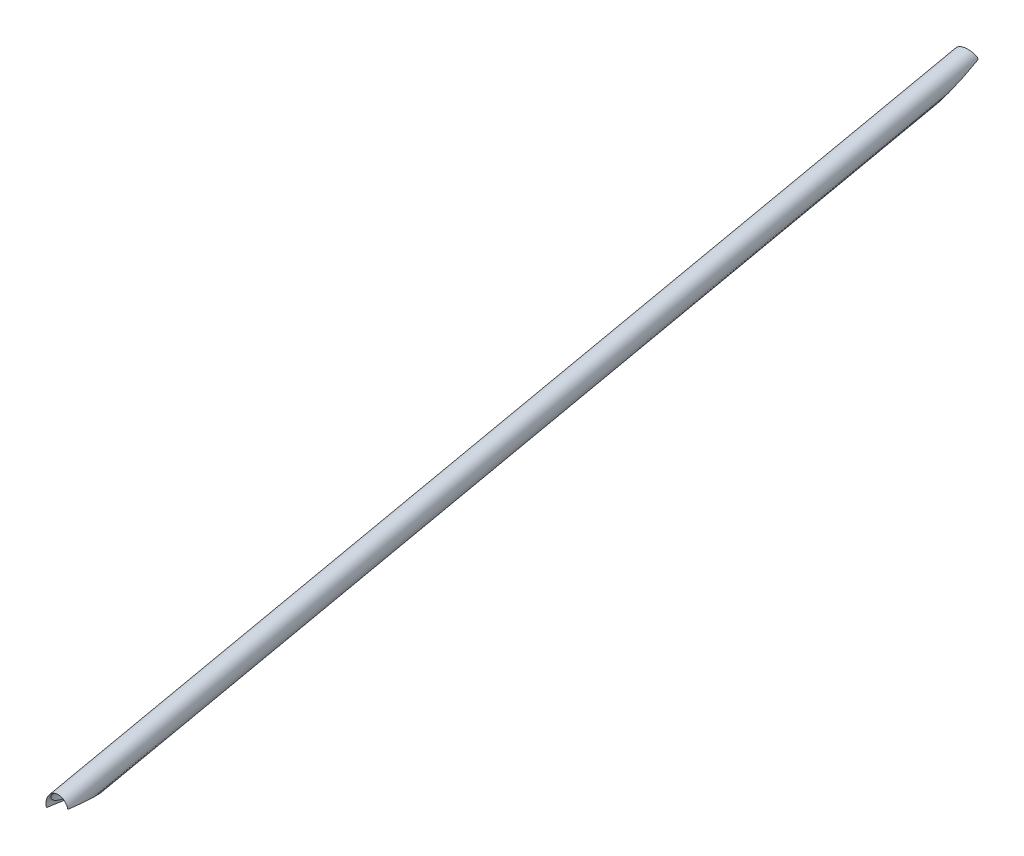
ISO-10303-21;
HEADER;
FILE_DESCRIPTION(('STEP AP214'),'2;1');
FILE_NAME('part.step','',(''),(''),'','','');
FILE_SCHEMA(('AUTOMOTIVE_DESIGN { 1 0 10303 214 1 1 1 1 }'));
ENDSEC;
DATA;
#1=APPLICATION_CONTEXT('core data for automotive mechanical design processes');
#2=APPLICATION_PROTOCOL_DEFINITION('international standard','automotive_design',2000,#1);
#3=PRODUCT_CONTEXT('',#1,'mechanical');
#4=PRODUCT('Part','Part','',(#3));
#5=PRODUCT_RELATED_PRODUCT_CATEGORY('part','',(#4));
#6=PRODUCT_DEFINITION_FORMATION('','',#4);
#7=PRODUCT_DEFINITION_CONTEXT('part definition',#1,'design');
#8=PRODUCT_DEFINITION('design','',#6,#7);
#9=PRODUCT_DEFINITION_SHAPE('','',#8);
#10=(LENGTH_UNIT() NAMED_UNIT(*) SI_UNIT(.MILLI.,.METRE.));
#11=(NAMED_UNIT(*) PLANE_ANGLE_UNIT() SI_UNIT($,.RADIAN.));
#12=(NAMED_UNIT(*) SI_UNIT($,.STERADIAN.) SOLID_ANGLE_UNIT());
#13=UNCERTAINTY_MEASURE_WITH_UNIT(LENGTH_MEASURE(1.E-05),#10,'distance_accuracy_value','');
#14=(GEOMETRIC_REPRESENTATION_CONTEXT(3) GLOBAL_UNCERTAINTY_ASSIGNED_CONTEXT((#13)) GLOBAL_UNIT_ASSIGNED_CONTEXT((#10,
#11,#12)) REPRESENTATION_CONTEXT('',''));
#15=CARTESIAN_POINT('',(0.,0.,0.));
#16=DIRECTION('',(0.,0.,1.));
#17=DIRECTION('',(1.,0.,0.));
#18=AXIS2_PLACEMENT_3D('',#15,#16,#17);
#19=CARTESIAN_POINT('',(-325.,320.,-1580.));
#20=DIRECTION('',(0.042712653678304,-0.062929792122569,-0.997103540500768));
#21=DIRECTION('',(0.,0.998014330188054,-0.0629872744234134));
#22=AXIS2_PLACEMENT_3D('',#19,#20,#21);
#23=PLANE('',#22);
#24=CARTESIAN_POINT('',(-325.,320.,-1580.));
#25=DIRECTION('',(0.042712653678304,-0.062929792122569,-0.997103540500768));
#26=DIRECTION('',(-0.611440895819702,0.787641342485716,-0.0759022168747456));
#27=AXIS2_PLACEMENT_3D('',#24,#25,#26);
#28=ELLIPSE('',#27,12.7897245671064,12.5);
#29=CARTESIAN_POINT('',(-314.143685620965,326.206690751994,-1579.92667136909));
#30=VERTEX_POINT('',#29);
#31=CARTESIAN_POINT('',(-313.287224923611,324.429594636014,-1579.7778262469));
#32=VERTEX_POINT('',#31);
#33=EDGE_CURVE('E114',#30,#32,#28,.T.);
#34=ORIENTED_EDGE('',*,*,#33,.T.);
#35=CARTESIAN_POINT('',(-324.999999999999,320.,-1580.));
#36=DIRECTION('',(0.042712653678304,-0.062929792122569,-0.997103540500768));
#37=DIRECTION('',(0.449608041943724,-0.890035166065743,0.0754321667848475));
#38=AXIS2_PLACEMENT_3D('',#35,#36,#37);
#39=ELLIPSE('',#38,15.3791838355893,12.5);
#40=EDGE_CURVE('E119',#32,#30,#39,.F.);
#41=ORIENTED_EDGE('',*,*,#40,.T.);
#42=EDGE_LOOP('',(#34,#41));
#43=FACE_BOUND('',#42,.T.);
#44=ADVANCED_FACE('F41',(#43),#23,.T.);
#45=CARTESIAN_POINT('',(-225.,200.,-450.));
#46=DIRECTION('',(-0.0876619818920292,0.105194378270435,-0.99058039537993));
#47=DIRECTION('',(0.,0.994408591727349,0.105600912395825));
#48=AXIS2_PLACEMENT_3D('',#45,#46,#47);
#49=CYLINDRICAL_SURFACE('',#48,11.3);
#50=CARTESIAN_POINT('',(-324.527494998541,330.669811084768,-1573.46740317344));
#51=CARTESIAN_POINT('',(-324.22991833195,330.671890688319,-1573.48694557491));
#52=CARTESIAN_POINT('',(-323.932307858229,330.662075607769,-1573.50633371624));
#53=CARTESIAN_POINT('',(-323.338640129705,330.618628362509,-1573.54347430956));
#54=CARTESIAN_POINT('',(-323.042583141786,330.584992232224,-1573.56122648864));
#55=CARTESIAN_POINT('',(-322.453437432487,330.493916145814,-1573.59343522251));
#56=CARTESIAN_POINT('',(-322.160354826378,330.436434552453,-1573.60788594374));
#57=CARTESIAN_POINT('',(-321.579575098919,330.297946482537,-1573.63130440361));
#58=CARTESIAN_POINT('',(-321.291877709912,330.216941178482,-1573.64027241545));
#59=CARTESIAN_POINT('',(-320.722131605198,330.031369165204,-1573.65006371326));
#60=CARTESIAN_POINT('',(-320.440126314284,329.926666056391,-1573.65083855758));
#61=CARTESIAN_POINT('',(-319.885608291381,329.694828115232,-1573.64072036513));
#62=CARTESIAN_POINT('',(-319.61309695512,329.567690001187,-1573.6298256202));
#63=CARTESIAN_POINT('',(-319.080659937344,329.292804597591,-1573.59232749403));
#64=CARTESIAN_POINT('',(-318.820702769833,329.145112906356,-1573.56576588472));
#65=CARTESIAN_POINT('',(-318.315280072179,328.831194619245,-1573.49234692427));
#66=CARTESIAN_POINT('',(-318.06980656504,328.664978374445,-1573.44550086577));
#67=CARTESIAN_POINT('',(-317.666361395377,328.369097827387,-1573.34450291742));
#68=CARTESIAN_POINT('',(-317.50402416305,328.243206821644,-1573.29663470223));
#69=CARTESIAN_POINT('',(-317.188822442626,327.98566765898,-1573.18722487599));
#70=CARTESIAN_POINT('',(-317.035955428439,327.854021053432,-1573.12568693148));
#71=CARTESIAN_POINT('',(-316.740668325697,327.587038164811,-1572.9881020213));
#72=CARTESIAN_POINT('',(-316.598235841143,327.451706530652,-1572.91207267115));
#73=CARTESIAN_POINT('',(-316.324158384668,327.179265680443,-1572.74518152417));
#74=CARTESIAN_POINT('',(-316.192513786003,327.042156403075,-1572.65431921445));
#75=CARTESIAN_POINT('',(-315.940506496505,326.768504881307,-1572.45844698739));
#76=CARTESIAN_POINT('',(-315.820116645126,326.631962073846,-1572.3534727027));
#77=CARTESIAN_POINT('',(-315.590002417244,326.360788903843,-1572.13025676735));
#78=CARTESIAN_POINT('',(-315.480278190465,326.22615856817,-1572.01201493049));
#79=CARTESIAN_POINT('',(-315.270779835019,325.95992960071,-1571.76360425056));
#80=CARTESIAN_POINT('',(-315.171015594934,325.828334079702,-1571.63342379566));
#81=CARTESIAN_POINT('',(-314.980681189384,325.569075396897,-1571.36284969414));
#82=CARTESIAN_POINT('',(-314.890111949128,325.441412631718,-1571.22245502219));
#83=CARTESIAN_POINT('',(-314.722987471503,325.198808644315,-1570.94275892204));
#84=CARTESIAN_POINT('',(-314.645899882952,325.08358810625,-1570.80401427361));
#85=CARTESIAN_POINT('',(-314.498054199409,324.856924491118,-1570.52018068149));
#86=CARTESIAN_POINT('',(-314.427297419092,324.745482201625,-1570.37509042933));
#87=CARTESIAN_POINT('',(-314.291318307502,324.526216542793,-1570.0795122743));
#88=CARTESIAN_POINT('',(-314.226100043918,324.418395867836,-1569.92902051781));
#89=CARTESIAN_POINT('',(-314.100556511849,324.206246967197,-1569.62359561608));
#90=CARTESIAN_POINT('',(-314.040231642548,324.101919026846,-1569.46866210989));
#91=CARTESIAN_POINT('',(-313.923582246642,323.896004336926,-1569.1543132864));
#92=CARTESIAN_POINT('',(-313.867278958263,323.79443367842,-1568.99487960706));
#93=CARTESIAN_POINT('',(-313.758466120743,323.59429591807,-1568.67286959075));
#94=CARTESIAN_POINT('',(-313.705956623255,323.495728857131,-1568.51029321102));
#95=CARTESIAN_POINT('',(-313.604298916831,323.30137323231,-1568.18257889695));
#96=CARTESIAN_POINT('',(-313.555148982218,323.205583256733,-1568.01744233199));
#97=CARTESIAN_POINT('',(-313.459798272915,323.016472440593,-1567.68493457679));
#98=CARTESIAN_POINT('',(-313.413597395101,322.923151513758,-1567.51756346494));
#99=CARTESIAN_POINT('',(-313.264779231262,322.617506999833,-1566.9596724199));
#100=CARTESIAN_POINT('',(-313.167825809873,322.409989574154,-1566.56499982454));
#101=CARTESIAN_POINT('',(-312.984719444651,322.004146345618,-1565.76845607));
#102=CARTESIAN_POINT('',(-312.898569002465,321.805822678438,-1565.366583268));
#103=CARTESIAN_POINT('',(-312.734928418317,321.416223222131,-1564.5573399317));
#104=CARTESIAN_POINT('',(-312.657444615259,321.224952659405,-1564.14996561445));
#105=CARTESIAN_POINT('',(-312.509735726778,320.84802295203,-1563.33131925227));
#106=CARTESIAN_POINT('',(-312.439510979912,320.662364069391,-1562.92004702652));
#107=CARTESIAN_POINT('',(-312.305114582053,320.294955819605,-1562.0934546475));
#108=CARTESIAN_POINT('',(-312.240959420199,320.113218082411,-1561.6781266684));
#109=CARTESIAN_POINT('',(-312.118172646877,319.753192904372,-1560.84516280767));
#110=CARTESIAN_POINT('',(-312.059541132376,319.57490552414,-1560.42752688566));
#111=CARTESIAN_POINT('',(-311.947300043115,319.221099630609,-1559.59063751702));
#112=CARTESIAN_POINT('',(-311.893688241762,319.045579918663,-1559.17138487427));
#113=CARTESIAN_POINT('',(-311.791087386183,318.696621502327,-1558.33144830653));
#114=CARTESIAN_POINT('',(-311.7420983873,318.523182822872,-1557.91076436446));
#115=CARTESIAN_POINT('',(-311.601344654273,318.00408952934,-1556.64425651327));
#116=CARTESIAN_POINT('',(-311.516157050634,317.660809736352,-1555.79672235769));
#117=CARTESIAN_POINT('',(-311.362133077917,316.977506271413,-1554.09877316485));
#118=CARTESIAN_POINT('',(-311.293298458222,316.637482951558,-1553.24835782923));
#119=CARTESIAN_POINT('',(-311.171912603106,315.959117750207,-1551.54729808268));
#120=CARTESIAN_POINT('',(-311.119335180671,315.620774037551,-1550.69665627256));
#121=CARTESIAN_POINT('',(-311.03081133304,314.943539747609,-1548.99476140396));
#122=CARTESIAN_POINT('',(-310.99486413293,314.604649196541,-1548.14350837583));
#123=CARTESIAN_POINT('',(-310.94876701369,314.025449030486,-1546.6930747546));
#124=CARTESIAN_POINT('',(-310.934131171509,313.785639909453,-1546.09383502125));
#125=CARTESIAN_POINT('',(-310.914303218245,313.304569709359,-1544.89578259034));
#126=CARTESIAN_POINT('',(-310.909111022314,313.063308643363,-1544.29696988901));
#127=CARTESIAN_POINT('',(-310.908988420093,312.578683348002,-1543.09967007323));
#128=CARTESIAN_POINT('',(-310.914065665461,312.33531768505,-1542.50118353415));
#129=CARTESIAN_POINT('',(-310.935583968858,311.846170099078,-1541.30540457908));
#130=CARTESIAN_POINT('',(-310.952024857439,311.600388212142,-1540.70811214541));
#131=CARTESIAN_POINT('',(-310.997617365976,311.106826035252,-1539.5175688299));
#132=CARTESIAN_POINT('',(-311.026718989419,310.859057330703,-1538.92431127933));
#133=CARTESIAN_POINT('',(-311.09951959715,310.359960337871,-1537.740199451));
#134=CARTESIAN_POINT('',(-311.143217999068,310.108632191981,-1537.14934507831));
#135=CARTESIAN_POINT('',(-311.247774414229,309.601860721366,-1535.97149207174));
#136=CARTESIAN_POINT('',(-311.30861802488,309.346421019588,-1535.38449062298));
#137=CARTESIAN_POINT('',(-311.451117984676,308.830300969743,-1534.21537921512));
#138=CARTESIAN_POINT('',(-311.532770602884,308.569621568835,-1533.63326839845));
#139=CARTESIAN_POINT('',(-311.699014480892,308.106822090654,-1532.61898781092));
#140=CARTESIAN_POINT('',(-311.777914412688,307.906115607689,-1532.18524556824));
#141=CARTESIAN_POINT('',(-311.954189365726,307.500122051136,-1531.32325464643));
#142=CARTESIAN_POINT('',(-312.051575358518,307.294832321544,-1530.89500939175));
#143=CARTESIAN_POINT('',(-312.215639560175,306.982368741453,-1530.2581118207));
#144=CARTESIAN_POINT('',(-312.273492765592,306.877190301256,-1530.0462006651));
#145=CARTESIAN_POINT('',(-312.396101860453,306.665340311064,-1529.62514989883));
#146=CARTESIAN_POINT('',(-312.460857050994,306.558668913196,-1529.41601000995));
#147=CARTESIAN_POINT('',(-312.598350696457,306.343781843623,-1529.00145086242));
#148=CARTESIAN_POINT('',(-312.671080888738,306.235567869426,-1528.79602800507));
#149=CARTESIAN_POINT('',(-312.826059561427,306.017350546439,-1528.38980559806));
#150=CARTESIAN_POINT('',(-312.908305823863,305.907347619727,-1528.18900498408));
#151=CARTESIAN_POINT('',(-313.085799217333,305.683490251871,-1527.79019457859));
#152=CARTESIAN_POINT('',(-313.18124384421,305.569602123161,-1527.59229049847));
#153=CARTESIAN_POINT('',(-313.38675763426,305.339792198979,-1527.2055542152));
#154=CARTESIAN_POINT('',(-313.496815788568,305.223871990845,-1527.01671532732));
#155=CARTESIAN_POINT('',(-313.734181841562,304.991249189082,-1526.65394275856));
#156=CARTESIAN_POINT('',(-313.861307869171,304.874565751826,-1526.47987984509));
#157=CARTESIAN_POINT('',(-314.13816302195,304.640333407195,-1526.15177347299));
#158=CARTESIAN_POINT('',(-314.287820200516,304.522788348705,-1525.9976690964));
#159=CARTESIAN_POINT('',(-314.563633703149,304.325856472094,-1525.76423516486));
#160=CARTESIAN_POINT('',(-314.682406209025,304.246081227636,-1525.67662272954));
#161=CARTESIAN_POINT('',(-314.934145658899,304.088965879863,-1525.52168072422));
#162=CARTESIAN_POINT('',(-315.067097142795,304.011623240966,-1525.45432936265));
#163=CARTESIAN_POINT('',(-315.325444360263,303.873327164501,-1525.35429015047));
#164=CARTESIAN_POINT('',(-315.449006299023,303.811650473049,-1525.31792909591));
#165=CARTESIAN_POINT('',(-315.703340012969,303.694275322767,-1525.2677158373));
#166=CARTESIAN_POINT('',(-315.834106261101,303.638572375029,-1525.25384661974));
#167=CARTESIAN_POINT('',(-316.099120024441,303.534997494025,-1525.24969480059));
#168=CARTESIAN_POINT('',(-316.233369185012,303.487129343011,-1525.2594235553));
#169=CARTESIAN_POINT('',(-316.501300294147,303.400151922389,-1525.30084409504));
#170=CARTESIAN_POINT('',(-316.634981577888,303.361051068657,-1525.33255686445));
#171=CARTESIAN_POINT('',(-316.948539945882,303.278323328622,-1525.43003928949));
#172=CARTESIAN_POINT('',(-317.126805360522,303.238560056806,-1525.50414618248));
#173=CARTESIAN_POINT('',(-317.473133616928,303.172898083276,-1525.67787821321));
#174=CARTESIAN_POINT('',(-317.641168701038,303.147035730978,-1525.7775692559));
#175=CARTESIAN_POINT('',(-317.950857105551,303.10832183224,-1525.98425298197));
#176=CARTESIAN_POINT('',(-318.093493855679,303.094458766495,-1526.08962322729));
#177=CARTESIAN_POINT('',(-318.370837841532,303.073973941512,-1526.31107579461));
#178=CARTESIAN_POINT('',(-318.505537871943,303.06735866915,-1526.42716761198));
#179=CARTESIAN_POINT('',(-318.768084530392,303.059980188981,-1526.6675449744));
#180=CARTESIAN_POINT('',(-318.895914365603,303.059230725614,-1526.7918490758));
#181=CARTESIAN_POINT('',(-319.145208896575,303.062552477599,-1527.04647384957));
#182=CARTESIAN_POINT('',(-319.266676036233,303.066621827665,-1527.17679217517));
#183=CARTESIAN_POINT('',(-319.576184800323,303.082430586274,-1527.52270697421));
#184=CARTESIAN_POINT('',(-319.75987553825,303.097326613682,-1527.7420451776));
#185=CARTESIAN_POINT('',(-320.115721893663,303.134993534608,-1528.18930275687));
#186=CARTESIAN_POINT('',(-320.287870858537,303.157768923944,-1528.41722696546));
#187=CARTESIAN_POINT('',(-320.622833431221,303.209619752799,-1528.87975948189));
#188=CARTESIAN_POINT('',(-320.785628826174,303.238706989491,-1529.11437958173));
#189=CARTESIAN_POINT('',(-321.103061771176,303.301998587488,-1529.58840721571));
#190=CARTESIAN_POINT('',(-321.257698345262,303.336203559111,-1529.82781531789));
#191=CARTESIAN_POINT('',(-321.560807150141,303.409086936623,-1530.31170647659));
#192=CARTESIAN_POINT('',(-321.709240173083,303.447789237176,-1530.55621039584));
#193=CARTESIAN_POINT('',(-321.99995903265,303.528870314996,-1531.04824607444));
#194=CARTESIAN_POINT('',(-322.142244606716,303.57124924906,-1531.29577796255));
#195=CARTESIAN_POINT('',(-322.421224462761,303.659129795593,-1531.79297768566));
#196=CARTESIAN_POINT('',(-322.557925877133,303.704627212405,-1532.04264227001));
#197=CARTESIAN_POINT('',(-322.826527622677,303.798410578825,-1532.54400604243));
#198=CARTESIAN_POINT('',(-322.958428062036,303.846696465532,-1532.79570518449));
#199=CARTESIAN_POINT('',(-323.368063365633,304.003029349413,-1533.59298671028));
#200=CARTESIAN_POINT('',(-323.637988615176,304.115591340788,-1534.14170651899));
#201=CARTESIAN_POINT('',(-324.161725815199,304.349974515007,-1535.24486455776));
#202=CARTESIAN_POINT('',(-324.415535183783,304.471797174649,-1535.79930368765));
#203=CARTESIAN_POINT('',(-324.909767499399,304.72329697255,-1536.91269556979));
#204=CARTESIAN_POINT('',(-325.150183359196,304.852978194838,-1537.47165053581));
#205=CARTESIAN_POINT('',(-325.61945592071,305.119121973216,-1538.59279337525));
#206=CARTESIAN_POINT('',(-325.848312231429,305.255584758381,-1539.15498135731));
#207=CARTESIAN_POINT('',(-326.296535935575,305.534940334334,-1540.28330159354));
#208=CARTESIAN_POINT('',(-326.515877249094,305.677848846495,-1540.84944028912));
#209=CARTESIAN_POINT('',(-326.945630735865,305.969273789334,-1541.98366101293));
#210=CARTESIAN_POINT('',(-327.156042796755,306.117790290535,-1542.55174306552));
#211=CARTESIAN_POINT('',(-327.568823834631,306.420054994818,-1543.68920686485));
#212=CARTESIAN_POINT('',(-327.771195420438,306.573801470423,-1544.25858812559));
#213=CARTESIAN_POINT('',(-328.168757652446,306.886388379949,-1545.3984647368));
#214=CARTESIAN_POINT('',(-328.363948192664,307.045228888987,-1545.96896010359));
#215=CARTESIAN_POINT('',(-328.747505132579,307.367686877886,-1547.10982530351));
#216=CARTESIAN_POINT('',(-328.935881746271,307.531296482325,-1547.68019393255));
#217=CARTESIAN_POINT('',(-329.30669372903,307.863586478885,-1548.82137645961));
#218=CARTESIAN_POINT('',(-329.489129161128,308.032266817174,-1549.39219035286));
#219=CARTESIAN_POINT('',(-329.848580120098,308.374910885762,-1550.53403720551));
#220=CARTESIAN_POINT('',(-330.025594852231,308.548875383405,-1551.10507018473));
#221=CARTESIAN_POINT('',(-330.374616319108,308.902396090813,-1552.24693351495));
#222=CARTESIAN_POINT('',(-330.546623071495,309.081952280873,-1552.81776386667));
#223=CARTESIAN_POINT('',(-330.885753791939,309.446871660756,-1553.95791220318));
#224=CARTESIAN_POINT('',(-331.052885260164,309.632224910716,-1554.52723113665));
#225=CARTESIAN_POINT('',(-331.38292658772,310.009755901746,-1555.66482798117));
#226=CARTESIAN_POINT('',(-331.545836474633,310.201933598207,-1556.23310589901));
#227=CARTESIAN_POINT('',(-331.867758219808,310.594141326559,-1557.36795173452));
#228=CARTESIAN_POINT('',(-332.026770678886,310.794170135616,-1557.93451990381));
#229=CARTESIAN_POINT('',(-332.34124464091,311.203592914434,-1559.06524233944));
#230=CARTESIAN_POINT('',(-332.496706289047,311.412986500233,-1559.6293967037));
#231=CARTESIAN_POINT('',(-332.722106457177,311.728258138706,-1560.45344686885));
#232=CARTESIAN_POINT('',(-332.793324196612,311.829615174441,-1560.71472502905));
#233=CARTESIAN_POINT('',(-332.935075595726,312.035127579553,-1561.23636364492));
#234=CARTESIAN_POINT('',(-333.005609257891,312.139282938757,-1561.49672410392));
#235=CARTESIAN_POINT('',(-333.216246899267,312.456485392485,-1562.27629829667));
#236=CARTESIAN_POINT('',(-333.355355059321,312.674223705631,-1562.79388590513));
#237=CARTESIAN_POINT('',(-333.63095588945,313.125769182318,-1563.82280400112));
#238=CARTESIAN_POINT('',(-333.767448505934,313.359576674666,-1564.33413436036));
#239=CARTESIAN_POINT('',(-333.969941892546,313.726329367481,-1565.09392242472));
#240=CARTESIAN_POINT('',(-334.037059025952,313.851240938043,-1565.34595975278));
#241=CARTESIAN_POINT('',(-334.170432465511,314.107345998761,-1565.84704537499));
#242=CARTESIAN_POINT('',(-334.236688814819,314.238539172435,-1566.09609381894));
#243=CARTESIAN_POINT('',(-334.38445645274,314.541720732593,-1566.6517281345));
#244=CARTESIAN_POINT('',(-334.465679453934,314.715762275802,-1566.95727899764));
#245=CARTESIAN_POINT('',(-334.625869590245,315.077928434653,-1567.5604948522));
#246=CARTESIAN_POINT('',(-334.70483724936,315.26604974166,-1567.85816167419));
#247=CARTESIAN_POINT('',(-334.859324831866,315.65951308438,-1568.44245404465));
#248=CARTESIAN_POINT('',(-334.934848209731,315.864837252396,-1568.72909060882));
#249=CARTESIAN_POINT('',(-335.080557479371,316.296711697071,-1569.28736012736));
#250=CARTESIAN_POINT('',(-335.150746356954,316.523249938985,-1569.55900145115));
#251=CARTESIAN_POINT('',(-335.259026068674,316.916378868446,-1569.98846772833));
#252=CARTESIAN_POINT('',(-335.29964914283,317.075604837321,-1570.15238811065));
#253=CARTESIAN_POINT('',(-335.376013908857,317.405325990618,-1570.46964962463));
#254=CARTESIAN_POINT('',(-335.411757489158,317.575816777277,-1570.62299483759));
#255=CARTESIAN_POINT('',(-335.476724835373,317.928155317378,-1570.91677810009));
#256=CARTESIAN_POINT('',(-335.505962897407,318.109977021365,-1571.05724404449));
#257=CARTESIAN_POINT('',(-335.556180165155,318.485068008389,-1571.323675769));
#258=CARTESIAN_POINT('',(-335.57715993474,318.67833650881,-1571.44964253867));
#259=CARTESIAN_POINT('',(-335.609090016825,319.077240914037,-1571.6867374229));
#260=CARTESIAN_POINT('',(-335.619937728547,319.282981335384,-1571.79770420828));
#261=CARTESIAN_POINT('',(-335.629398723454,319.703086105149,-1572.00254152323));
#262=CARTESIAN_POINT('',(-335.628011757801,319.917450628882,-1572.09641170503));
#263=CARTESIAN_POINT('',(-335.611545079815,320.352548792876,-1572.26744716928));
#264=CARTESIAN_POINT('',(-335.596446721692,320.573290709727,-1572.34458952696));
#265=CARTESIAN_POINT('',(-335.551595917877,321.018147940573,-1572.48323794376));
#266=CARTESIAN_POINT('',(-335.521843012214,321.24226336024,-1572.544743512));
#267=CARTESIAN_POINT('',(-335.451255159845,321.667255628348,-1572.64813729212));
#268=CARTESIAN_POINT('',(-335.411946546095,321.868053228953,-1572.6914203519));
#269=CARTESIAN_POINT('',(-335.32128071916,322.268700012012,-1572.76853827499));
#270=CARTESIAN_POINT('',(-335.269924798859,322.468549293891,-1572.8023741513));
#271=CARTESIAN_POINT('',(-335.155300112072,322.866002984559,-1572.8621495575));
#272=CARTESIAN_POINT('',(-335.092030100971,323.063607156523,-1572.88808826167));
#273=CARTESIAN_POINT('',(-334.953838724688,323.4554641707,-1572.93352422752));
#274=CARTESIAN_POINT('',(-334.878915679482,323.649716525187,-1572.95302055913));
#275=CARTESIAN_POINT('',(-334.700868460922,324.074182294663,-1572.99043530071));
#276=CARTESIAN_POINT('',(-334.595124504004,324.303404314177,-1573.00716755454));
#277=CARTESIAN_POINT('',(-334.367770503569,324.754182967731,-1573.03514738175));
#278=CARTESIAN_POINT('',(-334.246158976738,324.975738882684,-1573.04639444191));
#279=CARTESIAN_POINT('',(-333.987759225415,325.410114780624,-1573.0650795795));
#280=CARTESIAN_POINT('',(-333.850964091003,325.622930725273,-1573.07251591398));
#281=CARTESIAN_POINT('',(-333.563028535148,326.038702117453,-1573.0849444244));
#282=CARTESIAN_POINT('',(-333.411887185689,326.241656925809,-1573.0899364421));
#283=CARTESIAN_POINT('',(-333.067259252498,326.672836966421,-1573.0993841548));
#284=CARTESIAN_POINT('',(-332.871077072135,326.89892026651,-1573.10357598966));
#285=CARTESIAN_POINT('',(-332.461198236213,327.334640798934,-1573.1115585922));
#286=CARTESIAN_POINT('',(-332.247499640233,327.544276204166,-1573.11534931534));
#287=CARTESIAN_POINT('',(-331.803952259468,327.945939678915,-1573.12362335238));
#288=CARTESIAN_POINT('',(-331.574094899645,328.137958273149,-1573.12810703556));
#289=CARTESIAN_POINT('',(-331.099880100035,328.503107308841,-1573.13856383725));
#290=CARTESIAN_POINT('',(-330.855522785179,328.676237912999,-1573.14453694293));
#291=CARTESIAN_POINT('',(-330.340216711847,329.011477754562,-1573.15889938583));
#292=CARTESIAN_POINT('',(-330.068544522699,329.1724716486,-1573.16740269189));
#293=CARTESIAN_POINT('',(-329.512776249037,329.471224290825,-1573.18703988107));
#294=CARTESIAN_POINT('',(-329.228678969748,329.608980798327,-1573.19817401761));
#295=CARTESIAN_POINT('',(-328.650314384275,329.860195730283,-1573.22317310154));
#296=CARTESIAN_POINT('',(-328.356055404949,329.973673525465,-1573.23703585481));
#297=CARTESIAN_POINT('',(-327.759317908321,330.175642146556,-1573.26735157841));
#298=CARTESIAN_POINT('',(-327.456841197315,330.264138415586,-1573.28380398326));
#299=CARTESIAN_POINT('',(-326.722261769493,330.446088633366,-1573.3260282912));
#300=CARTESIAN_POINT('',(-326.287090521762,330.527141320321,-1573.35288235115));
#301=CARTESIAN_POINT('',(-325.41046842317,330.637454270104,-1573.40907221599));
#302=CARTESIAN_POINT('',(-324.969018923373,330.666725511116,-1573.43840749345));
#303=CARTESIAN_POINT('',(-324.527494998541,330.669811084768,-1573.46740317344));
#304=B_SPLINE_CURVE_WITH_KNOTS('',3,(#50,#51,#52,#53,#54,#55,#56,#57,#58,#59,#60,#61,#62,#63,
#64,#65,#66,#67,#68,#69,#70,#71,#72,#73,#74,#75,#76,#77,#78,#79,#80,#81,#82,#83,#84,#85,#86,#87,
#88,#89,#90,#91,#92,#93,#94,#95,#96,#97,#98,#99,#100,#101,#102,#103,#104,#105,#106,#107,#108,
#109,#110,#111,#112,#113,#114,#115,#116,#117,#118,#119,#120,#121,#122,#123,#124,#125,#126,#127,
#128,#129,#130,#131,#132,#133,#134,#135,#136,#137,#138,#139,#140,#141,#142,#143,#144,#145,#146,
#147,#148,#149,#150,#151,#152,#153,#154,#155,#156,#157,#158,#159,#160,#161,#162,#163,#164,#165,
#166,#167,#168,#169,#170,#171,#172,#173,#174,#175,#176,#177,#178,#179,#180,#181,#182,#183,#184,
#185,#186,#187,#188,#189,#190,#191,#192,#193,#194,#195,#196,#197,#198,#199,#200,#201,#202,#203,
#204,#205,#206,#207,#208,#209,#210,#211,#212,#213,#214,#215,#216,#217,#218,#219,#220,#221,#222,
#223,#224,#225,#226,#227,#228,#229,#230,#231,#232,#233,#234,#235,#236,#237,#238,#239,#240,#241,
#242,#243,#244,#245,#246,#247,#248,#249,#250,#251,#252,#253,#254,#255,#256,#257,#258,#259,#260,
#261,#262,#263,#264,#265,#266,#267,#268,#269,#270,#271,#272,#273,#274,#275,#276,#277,#278,#279,
#280,#281,#282,#283,#284,#285,#286,#287,#288,#289,#290,#291,#292,#293,#294,#295,#296,#297,#298,
#299,#300,#301,#302,#303),.UNSPECIFIED.,.T.,.F.,(4,2,2,2,2,2,2,2,2,2,2,2,2,2,2,2,2,2,2,2,2,2,2,
2,2,2,2,2,2,2,2,2,2,2,2,2,2,2,2,2,2,2,2,2,2,2,2,2,2,2,2,2,2,2,2,2,2,2,2,2,2,2,2,2,2,2,2,2,2,2,2,
2,2,2,2,2,2,2,2,2,2,2,2,2,2,2,2,2,2,2,2,2,2,2,2,2,2,2,2,2,2,2,2,2,2,2,2,2,2,2,2,2,2,2,2,2,2,2,2,
2,2,2,2,2,2,2,4),(0.,0.894332873184559,1.78881466416801,2.68486495352008,3.58087058837736,
4.48217086517109,5.38360308979591,6.28264265755242,7.18118235880469,7.81332672446162,
8.44530173915707,9.07651337906165,9.70774684942628,10.3374153904895,10.9670927694756,
11.5973892210165,12.2277490309353,12.8158820119252,13.4041368443416,13.9928200421915,
14.5815512144624,15.1731912811312,15.7648394018262,16.3561812961773,16.947502501131,
18.3160450871592,19.6849040040111,21.0547576659585,22.4246751881547,23.7982134567405,
25.1717758330333,26.5447260232331,27.9176926478447,30.6726235074088,33.4278489466516,
36.1786128793508,38.929248622432,40.8660139413755,42.8027618590715,44.740953359807,
46.6791159597697,48.6096933693702,50.5401937638898,52.4690772785442,54.3976151983063,
55.8505205094213,57.3042908370961,58.0348437224327,58.7653227012972,59.4950518806533,
60.2246113187986,60.9665911620902,61.70801518497,62.4420872122222,63.173863053845,
63.6757835639771,64.1771622926803,64.6037114717474,65.0299378452197,65.4563693767203,
65.8832085111084,66.4711807122136,67.0606830088465,67.5935322931944,68.1268580964081,
68.6614331862451,69.1958014183136,70.054578413963,70.9138462221922,71.7747340965264,
72.6357247183567,73.501519230141,74.3673506838368,75.2320392721824,76.0967083629874,
77.9616457841675,79.8268812336297,81.6930944844876,83.5593708171973,85.4304752840253,
87.3016032887986,89.172119142993,91.0426625924134,92.9102749439718,94.7778674756027,
96.6457325205879,98.5135909840689,100.378405600813,102.243208030064,104.107721154683,
105.972157903045,106.839613901039,107.70706674618,109.442366258363,111.177701288633,
112.045200412666,112.912655876065,113.995066845247,115.077224250162,116.158271287943,
117.238708720654,117.934558432983,118.630138073956,119.32417371514,120.018161959894,
120.719103916443,121.420060129333,122.121970985274,122.823903873886,123.450733421191,
124.07749572959,124.704323549618,125.331241823668,126.089491930874,126.847812970743,
127.606480541577,128.365197221927,129.262288261253,130.159478812533,131.057149127074,
131.954811708494,132.901410043476,133.848099602837,134.79403100741,135.739756147553,
137.06698757618,138.393937584726),.UNSPECIFIED.);
#305=CARTESIAN_POINT('',(-324.527494998541,330.669811084768,-1573.46740317344));
#306=VERTEX_POINT('',#305);
#307=EDGE_CURVE('E107',#306,#306,#304,.T.);
#308=ORIENTED_EDGE('',*,*,#307,.T.);
#309=EDGE_LOOP('',(#308));
#310=FACE_BOUND('',#309,.T.);
#311=CARTESIAN_POINT('',(-225.469006850872,211.799625307566,-454.106487104784));
#312=CARTESIAN_POINT('',(-225.785366428996,211.796948836503,-454.081299492521));
#313=CARTESIAN_POINT('',(-226.101803384856,211.781019581039,-454.057986250762));
#314=CARTESIAN_POINT('',(-226.732468057768,211.722660532054,-454.014365027228));
#315=CARTESIAN_POINT('',(-227.046695371285,211.680226018926,-453.994057581472));
#316=CARTESIAN_POINT('',(-227.670875379768,211.569042834636,-453.955948300176));
#317=CARTESIAN_POINT('',(-227.980824531351,211.500273565094,-453.938148440954));
#318=CARTESIAN_POINT('',(-228.593935993561,211.336871161124,-453.904800965572));
#319=CARTESIAN_POINT('',(-228.89709861409,211.242239210316,-453.889253246393));
#320=CARTESIAN_POINT('',(-229.494406202656,211.027788525585,-453.860333910742));
#321=CARTESIAN_POINT('',(-229.788553307714,210.907975814206,-453.846961775285));
#322=CARTESIAN_POINT('',(-230.365813994532,210.644002977559,-453.822493882598));
#323=CARTESIAN_POINT('',(-230.648927451497,210.499842577008,-453.811398151109));
#324=CARTESIAN_POINT('',(-231.202043952536,210.18826844461,-453.791774011335));
#325=CARTESIAN_POINT('',(-231.472050647995,210.020861239796,-453.783244884543));
#326=CARTESIAN_POINT('',(-231.997158999749,209.663997936506,-453.769230853604));
#327=CARTESIAN_POINT('',(-232.252260712228,209.47454192115,-453.763745937981));
#328=CARTESIAN_POINT('',(-232.745713083792,209.075072977602,-453.756518495273));
#329=CARTESIAN_POINT('',(-232.984070431839,208.865068339228,-453.754774465477));
#330=CARTESIAN_POINT('',(-233.442546483027,208.426018706836,-453.755972711585));
#331=CARTESIAN_POINT('',(-233.662664958362,208.19697347507,-453.758915046013));
#332=CARTESIAN_POINT('',(-234.083394050245,207.72139477196,-453.770747633444));
#333=CARTESIAN_POINT('',(-234.283987323691,207.47484608342,-453.779643120048));
#334=CARTESIAN_POINT('',(-234.664145980021,206.966406235946,-453.805035039074));
#335=CARTESIAN_POINT('',(-234.84371195097,206.704515506386,-453.821531258864));
#336=CARTESIAN_POINT('',(-235.180469051067,206.167955292694,-453.864239636738));
#337=CARTESIAN_POINT('',(-235.337690105482,205.893303565818,-453.890438627513));
#338=CARTESIAN_POINT('',(-235.629136632927,205.333376509922,-453.955327800399));
#339=CARTESIAN_POINT('',(-235.763358099857,205.04809934066,-453.994020155244));
#340=CARTESIAN_POINT('',(-236.007859375343,204.470519241779,-454.087353086437));
#341=CARTESIAN_POINT('',(-236.118178207386,204.178228642406,-454.141967321435));
#342=CARTESIAN_POINT('',(-236.31471312663,203.590113575864,-454.271536074364));
#343=CARTESIAN_POINT('',(-236.400943345999,203.294291287326,-454.346478615116));
#344=CARTESIAN_POINT('',(-236.523892982569,202.805864770777,-454.491538678668));
#345=CARTESIAN_POINT('',(-236.567435671811,202.612803834881,-454.554427175182));
#346=CARTESIAN_POINT('',(-236.644483571332,202.229134966099,-454.692555260623));
#347=CARTESIAN_POINT('',(-236.677992036061,202.038526257106,-454.76779083268));
#348=CARTESIAN_POINT('',(-236.735346400416,201.662161200172,-454.93172231769));
#349=CARTESIAN_POINT('',(-236.759212919481,201.47639530082,-455.020388943397));
#350=CARTESIAN_POINT('',(-236.798065054386,201.111486136915,-455.212175102728));
#351=CARTESIAN_POINT('',(-236.813050766368,200.932342800687,-455.315294479874));
#352=CARTESIAN_POINT('',(-236.835137025148,200.581956655144,-455.536785093914));
#353=CARTESIAN_POINT('',(-236.842197722198,200.410757886493,-455.655230099332));
#354=CARTESIAN_POINT('',(-236.849477192965,200.07906891813,-455.906432678919));
#355=CARTESIAN_POINT('',(-236.849696171103,199.918578398612,-456.039189825342));
#356=CARTESIAN_POINT('',(-236.844581405037,199.609413978921,-456.317854615278));
#357=CARTESIAN_POINT('',(-236.839244456291,199.460746951554,-456.463769803712));
#358=CARTESIAN_POINT('',(-236.82426698987,199.175727522408,-456.766994286826));
#359=CARTESIAN_POINT('',(-236.814624907786,199.03937961886,-456.924307706));
#360=CARTESIAN_POINT('',(-236.787403974577,198.723685684425,-457.316954353744));
#361=CARTESIAN_POINT('',(-236.768193070357,198.550532172803,-457.557154102653));
#362=CARTESIAN_POINT('',(-236.725772883688,198.226343619646,-458.051675126189));
#363=CARTESIAN_POINT('',(-236.702561176134,198.075322096845,-458.306004902056));
#364=CARTESIAN_POINT('',(-236.653601748371,197.79156858045,-458.825861220977));
#365=CARTESIAN_POINT('',(-236.627842932207,197.658923249182,-459.091433587821));
#366=CARTESIAN_POINT('',(-236.588075790934,197.471921229991,-459.495076753197));
#367=CARTESIAN_POINT('',(-236.574633341402,197.411587052198,-459.630491276995));
#368=CARTESIAN_POINT('',(-236.547437385271,197.294530371211,-459.902843606337));
#369=CARTESIAN_POINT('',(-236.533683880279,197.23780784936,-460.039781404007));
#370=CARTESIAN_POINT('',(-236.494755905938,197.083311883857,-460.425629892339));
#371=CARTESIAN_POINT('',(-236.469295190825,196.989226688089,-460.675990084084));
#372=CARTESIAN_POINT('',(-236.417740563362,196.809977056086,-461.17983740023));
#373=CARTESIAN_POINT('',(-236.391646540041,196.724814197366,-461.433325068759));
#374=CARTESIAN_POINT('',(-236.338896469503,196.561967284823,-461.942793620591));
#375=CARTESIAN_POINT('',(-236.31224009097,196.484287798914,-462.198775922985));
#376=CARTESIAN_POINT('',(-236.258401419644,196.335326448023,-462.712547049194));
#377=CARTESIAN_POINT('',(-236.231219091037,196.264045020603,-462.970335995268));
#378=CARTESIAN_POINT('',(-236.148732312944,196.058027422702,-463.747037957816));
#379=CARTESIAN_POINT('',(-236.092616100843,195.931503630719,-464.268044829012));
#380=CARTESIAN_POINT('',(-235.977917188768,195.69485308536,-465.313243148275));
#381=CARTESIAN_POINT('',(-235.919335294306,195.584721029507,-465.837433509173));
#382=CARTESIAN_POINT('',(-235.799012864794,195.376796980855,-466.889960102452));
#383=CARTESIAN_POINT('',(-235.737261244181,195.279053124386,-467.418304515216));
#384=CARTESIAN_POINT('',(-235.610338624014,195.093872518996,-468.476411217175));
#385=CARTESIAN_POINT('',(-235.54516738148,195.006436503932,-469.006173604579));
#386=CARTESIAN_POINT('',(-235.41105124497,194.840261530295,-470.065765616534));
#387=CARTESIAN_POINT('',(-235.342112051043,194.761509950547,-470.595593992579));
#388=CARTESIAN_POINT('',(-235.199923858482,194.611338973343,-471.655694304559));
#389=CARTESIAN_POINT('',(-235.126674965771,194.539919395799,-472.185966229276));
#390=CARTESIAN_POINT('',(-234.978330406514,194.406187082795,-473.226177614891));
#391=CARTESIAN_POINT('',(-234.903415322576,194.343629159327,-473.736111387465));
#392=CARTESIAN_POINT('',(-234.748755119195,194.223963829146,-474.755891521551));
#393=CARTESIAN_POINT('',(-234.669009949282,194.166856479403,-475.265737882094));
#394=CARTESIAN_POINT('',(-234.504202744256,194.057707829622,-476.285342892355));
#395=CARTESIAN_POINT('',(-234.419138424652,194.005668731199,-476.795101408781));
#396=CARTESIAN_POINT('',(-234.243227393487,193.906461213239,-477.814094091374));
#397=CARTESIAN_POINT('',(-234.152380702737,193.859292776173,-478.323328259422));
#398=CARTESIAN_POINT('',(-233.964543417553,193.769814682535,-479.339976571362));
#399=CARTESIAN_POINT('',(-233.867566144033,193.727495017623,-479.847392290697));
#400=CARTESIAN_POINT('',(-233.666659897462,193.647602249525,-480.861214198831));
#401=CARTESIAN_POINT('',(-233.562731051685,193.610029059475,-481.367620405939));
#402=CARTESIAN_POINT('',(-233.347201537938,193.53974487618,-482.37898544961));
#403=CARTESIAN_POINT('',(-233.235603109415,193.507032472379,-482.883944664198));
#404=CARTESIAN_POINT('',(-233.003813314513,193.446673898302,-483.892190716151));
#405=CARTESIAN_POINT('',(-232.883622113029,193.419027630845,-484.395477585414));
#406=CARTESIAN_POINT('',(-232.66448306039,193.375321492931,-485.275639732475));
#407=CARTESIAN_POINT('',(-232.567637464783,193.358087360057,-485.652980360639));
#408=CARTESIAN_POINT('',(-232.367882911176,193.326895058506,-486.406187084643));
#409=CARTESIAN_POINT('',(-232.264974067452,193.312936828112,-486.782053208133));
#410=CARTESIAN_POINT('',(-232.052347456857,193.288557722816,-487.532214601878));
#411=CARTESIAN_POINT('',(-231.94262572277,193.278138932253,-487.906508818775));
#412=CARTESIAN_POINT('',(-231.715596466751,193.26120028818,-488.652879778718));
#413=CARTESIAN_POINT('',(-231.598289079372,193.254680365533,-489.024956560969));
#414=CARTESIAN_POINT('',(-231.354933303572,193.245989970484,-489.766716317114));
#415=CARTESIAN_POINT('',(-231.228876289804,193.2438238549,-490.136396524512));
#416=CARTESIAN_POINT('',(-230.966826966697,193.244453674406,-490.872209121126));
#417=CARTESIAN_POINT('',(-230.830835269419,193.247249304057,-491.238341727333));
#418=CARTESIAN_POINT('',(-230.547362407188,193.258598404343,-491.965655187239));
#419=CARTESIAN_POINT('',(-230.399892616405,193.26714623751,-492.326840536217));
#420=CARTESIAN_POINT('',(-230.091165672654,193.291078997577,-493.042996640001));
#421=CARTESIAN_POINT('',(-229.92991207756,193.306462164421,-493.397968970181));
#422=CARTESIAN_POINT('',(-229.624991472366,193.341637703177,-494.028185288041));
#423=CARTESIAN_POINT('',(-229.484394365142,193.359902221023,-494.304992957789));
#424=CARTESIAN_POINT('',(-229.190336724397,193.402863177001,-494.851440611042));
#425=CARTESIAN_POINT('',(-229.036869566808,193.42756294123,-495.121076808267));
#426=CARTESIAN_POINT('',(-228.715269710686,193.484737523567,-495.648720906832));
#427=CARTESIAN_POINT('',(-228.547219353367,193.517170290645,-495.906783027017));
#428=CARTESIAN_POINT('',(-228.192355574185,193.591920914644,-496.407992773371));
#429=CARTESIAN_POINT('',(-228.005566424769,193.634226075696,-496.651159052721));
#430=CARTESIAN_POINT('',(-227.661188228023,193.718752498411,-497.053448500685));
#431=CARTESIAN_POINT('',(-227.508990913105,193.758021116338,-497.217758713822));
#432=CARTESIAN_POINT('',(-227.189588482857,193.845105117442,-497.529416600921));
#433=CARTESIAN_POINT('',(-227.022362412346,193.892932529484,-497.676739915355));
#434=CARTESIAN_POINT('',(-226.66921281291,193.999475334089,-497.948336494045));
#435=CARTESIAN_POINT('',(-226.483077044857,194.058322464575,-498.072290003281));
#436=CARTESIAN_POINT('',(-226.094693305669,194.187766544831,-498.283234118054));
#437=CARTESIAN_POINT('',(-225.892502851544,194.25832245686,-498.370350177392));
#438=CARTESIAN_POINT('',(-225.534585331229,194.389613986045,-498.478617075886));
#439=CARTESIAN_POINT('',(-225.381397822575,194.447702605751,-498.511327518039));
#440=CARTESIAN_POINT('',(-225.073408764815,194.568486802078,-498.548356625461));
#441=CARTESIAN_POINT('',(-224.918608048332,194.631180094226,-498.552689274604));
#442=CARTESIAN_POINT('',(-224.612341708455,194.759133592496,-498.533083756912));
#443=CARTESIAN_POINT('',(-224.460870053029,194.824388433669,-498.509201917304));
#444=CARTESIAN_POINT('',(-224.164498764995,194.95571157332,-498.436290006004));
#445=CARTESIAN_POINT('',(-224.01960596116,195.02178063044,-498.387234425725));
#446=CARTESIAN_POINT('',(-223.667789166382,195.186337052757,-498.238492381708));
#447=CARTESIAN_POINT('',(-223.466259241544,195.284440549071,-498.1257510868));
#448=CARTESIAN_POINT('',(-223.083390600998,195.476969563728,-497.867670616143));
#449=CARTESIAN_POINT('',(-222.902110076391,195.571383999585,-497.722240936689));
#450=CARTESIAN_POINT('',(-222.568342658434,195.750237201083,-497.418865859746));
#451=CARTESIAN_POINT('',(-222.414770954519,195.834932459126,-497.262238597473));
#452=CARTESIAN_POINT('',(-222.12119884087,196.00080113084,-496.934893954257));
#453=CARTESIAN_POINT('',(-221.981211628588,196.081971078185,-496.764163163825));
#454=CARTESIAN_POINT('',(-221.71248104804,196.24128242412,-496.411983273887));
#455=CARTESIAN_POINT('',(-221.583769881109,196.319414816093,-496.230505809481));
#456=CARTESIAN_POINT('',(-221.336336532907,196.472750586878,-495.859865712765));
#457=CARTESIAN_POINT('',(-221.217610088302,196.547955208363,-495.67070641218));
#458=CARTESIAN_POINT('',(-220.914914373837,196.743432793175,-495.162672932479));
#459=CARTESIAN_POINT('',(-220.738147909526,196.861552078173,-494.838686329594));
#460=CARTESIAN_POINT('',(-220.402721476698,197.092238173664,-494.179474238649));
#461=CARTESIAN_POINT('',(-220.244071980268,197.204801751683,-493.844242393919));
#462=CARTESIAN_POINT('',(-219.941351810713,197.425513546937,-493.164979461682));
#463=CARTESIAN_POINT('',(-219.797311964195,197.533652152097,-492.820931611432));
#464=CARTESIAN_POINT('',(-219.521782425203,197.745992731039,-492.126783342761));
#465=CARTESIAN_POINT('',(-219.390290083048,197.850195533131,-491.776684220724));
#466=CARTESIAN_POINT('',(-219.13766830026,198.055551620419,-491.070774387044));
#467=CARTESIAN_POINT('',(-219.016567359754,198.156696055161,-490.714950958195));
#468=CARTESIAN_POINT('',(-218.783715957741,198.356124670655,-489.9994607158));
#469=CARTESIAN_POINT('',(-218.671965902071,198.454408727143,-489.639793736202));
#470=CARTESIAN_POINT('',(-218.456860113592,198.648383532648,-488.917784056258));
#471=CARTESIAN_POINT('',(-218.353494287265,198.744077304654,-488.555445163835));
#472=CARTESIAN_POINT('',(-218.154141018561,198.933323036241,-487.828183516414));
#473=CARTESIAN_POINT('',(-218.058153806528,199.026874928893,-487.46326068114));
#474=CARTESIAN_POINT('',(-217.824665793068,199.260290273684,-486.54089270768));
#475=CARTESIAN_POINT('',(-217.691538798438,199.398934119359,-485.982030127123));
#476=CARTESIAN_POINT('',(-217.438804597379,199.672756942195,-484.860408728696));
#477=CARTESIAN_POINT('',(-217.319198025484,199.807935756508,-484.297649729277));
#478=CARTESIAN_POINT('',(-217.092033388032,200.0756366296,-483.168643253824));
#479=CARTESIAN_POINT('',(-216.984484006068,200.208156717881,-482.602393569522));
#480=CARTESIAN_POINT('',(-216.78048803281,200.471096497323,-481.467430625076));
#481=CARTESIAN_POINT('',(-216.684041251508,200.601516224397,-480.898717407265));
#482=CARTESIAN_POINT('',(-216.501042490606,200.86152175134,-479.756559318014));
#483=CARTESIAN_POINT('',(-216.414540485818,200.99110049376,-479.18310485544));
#484=CARTESIAN_POINT('',(-216.251431497287,201.249451767661,-478.034607659604));
#485=CARTESIAN_POINT('',(-216.174824591906,201.37822429275,-477.459564913802));
#486=CARTESIAN_POINT('',(-216.03126214301,201.635547705224,-476.308898934917));
#487=CARTESIAN_POINT('',(-215.964296121598,201.764098680891,-475.733277027251));
#488=CARTESIAN_POINT('',(-215.83981048661,202.021951629236,-474.581190084076));
#489=CARTESIAN_POINT('',(-215.782290724443,202.151253590066,-474.004725061973));
#490=CARTESIAN_POINT('',(-215.676297342434,202.412931579461,-472.845491776071));
#491=CARTESIAN_POINT('',(-215.627920903652,202.545325463634,-472.262718627237));
#492=CARTESIAN_POINT('',(-215.541384833447,202.813230087548,-471.09708587747));
#493=CARTESIAN_POINT('',(-215.503225844226,202.948741022626,-470.514226273406));
#494=CARTESIAN_POINT('',(-215.437877707109,203.22510665277,-469.346887367347));
#495=CARTESIAN_POINT('',(-215.410729163031,203.365979068706,-468.762409931625));
#496=CARTESIAN_POINT('',(-215.369128576079,203.654970872624,-467.594901329147));
#497=CARTESIAN_POINT('',(-215.354674021849,203.803088821039,-467.011869899087));
#498=CARTESIAN_POINT('',(-215.341056242206,204.107799617913,-465.856648314011));
#499=CARTESIAN_POINT('',(-215.341677975015,204.264241557401,-465.284422091972));
#500=CARTESIAN_POINT('',(-215.35679934576,204.51035328561,-464.429322232237));
#501=CARTESIAN_POINT('',(-215.364211825245,204.594343322652,-464.144687999252));
#502=CARTESIAN_POINT('',(-215.384566706396,204.766946613262,-463.577031362705));
#503=CARTESIAN_POINT('',(-215.397508721849,204.855559543561,-463.294008847972));
#504=CARTESIAN_POINT('',(-215.429814744588,205.037805959353,-462.731905533749));
#505=CARTESIAN_POINT('',(-215.44913795183,205.131404458707,-462.452811144633));
#506=CARTESIAN_POINT('',(-215.495530205418,205.325297742393,-461.897527652148));
#507=CARTESIAN_POINT('',(-215.522600478376,205.425593585202,-461.62133901604));
#508=CARTESIAN_POINT('',(-215.58614032758,205.634038226798,-461.073576174118));
#509=CARTESIAN_POINT('',(-215.622593000737,205.742172654699,-460.801994596618));
#510=CARTESIAN_POINT('',(-215.707137296288,205.967951054032,-460.26470614352));
#511=CARTESIAN_POINT('',(-215.755223197325,206.085590331983,-459.998996449952));
#512=CARTESIAN_POINT('',(-215.832354228658,206.257286683608,-459.634386882303));
#513=CARTESIAN_POINT('',(-215.855280448314,206.306675724243,-459.531973453034));
#514=CARTESIAN_POINT('',(-215.903593198278,206.407261204234,-459.328617811131));
#515=CARTESIAN_POINT('',(-215.92897988036,206.458457754963,-459.227675689696));
#516=CARTESIAN_POINT('',(-216.009165210531,206.614909846436,-458.927306689644));
#517=CARTESIAN_POINT('',(-216.067979268168,206.723005485202,-458.730384967344));
#518=CARTESIAN_POINT('',(-216.197885435789,206.946686338659,-458.34600387019));
#519=CARTESIAN_POINT('',(-216.268932565221,207.062243178676,-458.158512972013));
#520=CARTESIAN_POINT('',(-216.425239406564,207.300991939507,-457.794610401712));
#521=CARTESIAN_POINT('',(-216.510495579978,207.424181954635,-457.618195986218));
#522=CARTESIAN_POINT('',(-216.682916182638,207.658484998254,-457.303967557761));
#523=CARTESIAN_POINT('',(-216.767935785568,207.76869159927,-457.164302339227));
#524=CARTESIAN_POINT('',(-216.949898924778,207.992764863198,-456.896116264739));
#525=CARTESIAN_POINT('',(-217.046841004955,208.106631077905,-456.767594051142));
#526=CARTESIAN_POINT('',(-217.252863495969,208.336577700197,-456.522491868739));
#527=CARTESIAN_POINT('',(-217.361956548969,208.452660307774,-456.405924584868));
#528=CARTESIAN_POINT('',(-217.591848342777,208.685083589754,-456.185248717886));
#529=CARTESIAN_POINT('',(-217.712647934537,208.801424282316,-456.0811410417));
#530=CARTESIAN_POINT('',(-217.964617626649,209.031907380034,-455.885633063535));
#531=CARTESIAN_POINT('',(-218.095735630123,209.146057612679,-455.794174637121));
#532=CARTESIAN_POINT('',(-218.367902937798,209.370993545579,-455.622666990394));
#533=CARTESIAN_POINT('',(-218.508952172818,209.481779269264,-455.542617690616));
#534=CARTESIAN_POINT('',(-218.800121634315,209.698616046374,-455.392814627819));
#535=CARTESIAN_POINT('',(-218.950251187432,209.80466203025,-455.323071712817));
#536=CARTESIAN_POINT('',(-219.258464028167,210.010702085151,-455.192789978481));
#537=CARTESIAN_POINT('',(-219.416549174929,210.110694729431,-455.132253323978));
#538=CARTESIAN_POINT('',(-219.811472560592,210.346483784854,-454.994090888429));
#539=CARTESIAN_POINT('',(-220.052121035769,210.478471915685,-454.920806647151));
#540=CARTESIAN_POINT('',(-220.545480471709,210.72564147111,-454.787610364552));
#541=CARTESIAN_POINT('',(-220.798196004229,210.840816457702,-454.727703440978));
#542=CARTESIAN_POINT('',(-221.313523023597,211.052904995535,-454.618448157053));
#543=CARTESIAN_POINT('',(-221.576139712322,211.14980878238,-454.569105440472));
#544=CARTESIAN_POINT('',(-222.109068266934,211.324211946347,-454.478756081447));
#545=CARTESIAN_POINT('',(-222.37937864593,211.401715044885,-454.437747840577));
#546=CARTESIAN_POINT('',(-222.881845533389,211.525736541167,-454.36834794399));
#547=CARTESIAN_POINT('',(-223.113140191645,211.575234259734,-454.338987967579));
#548=CARTESIAN_POINT('',(-223.578855914781,211.6597611991,-454.284026188253));
#549=CARTESIAN_POINT('',(-223.813277647181,211.694787277996,-454.25842520222));
#550=CARTESIAN_POINT('',(-224.284057146053,211.750110960289,-454.210321115595));
#551=CARTESIAN_POINT('',(-224.520413973657,211.770415322415,-454.187816597265));
#552=CARTESIAN_POINT('',(-224.994168237944,211.796177448125,-454.145351675954));
#553=CARTESIAN_POINT('',(-225.231565750464,211.801634111087,-454.125391461681));
#554=CARTESIAN_POINT('',(-225.469006850872,211.799625307566,-454.106487104784));
#555=B_SPLINE_CURVE_WITH_KNOTS('',3,(#311,#312,#313,#314,#315,#316,#317,#318,#319,#320,#321,
#322,#323,#324,#325,#326,#327,#328,#329,#330,#331,#332,#333,#334,#335,#336,#337,#338,#339,#340,
#341,#342,#343,#344,#345,#346,#347,#348,#349,#350,#351,#352,#353,#354,#355,#356,#357,#358,#359,
#360,#361,#362,#363,#364,#365,#366,#367,#368,#369,#370,#371,#372,#373,#374,#375,#376,#377,#378,
#379,#380,#381,#382,#383,#384,#385,#386,#387,#388,#389,#390,#391,#392,#393,#394,#395,#396,#397,
#398,#399,#400,#401,#402,#403,#404,#405,#406,#407,#408,#409,#410,#411,#412,#413,#414,#415,#416,
#417,#418,#419,#420,#421,#422,#423,#424,#425,#426,#427,#428,#429,#430,#431,#432,#433,#434,#435,
#436,#437,#438,#439,#440,#441,#442,#443,#444,#445,#446,#447,#448,#449,#450,#451,#452,#453,#454,
#455,#456,#457,#458,#459,#460,#461,#462,#463,#464,#465,#466,#467,#468,#469,#470,#471,#472,#473,
#474,#475,#476,#477,#478,#479,#480,#481,#482,#483,#484,#485,#486,#487,#488,#489,#490,#491,#492,
#493,#494,#495,#496,#497,#498,#499,#500,#501,#502,#503,#504,#505,#506,#507,#508,#509,#510,#511,
#512,#513,#514,#515,#516,#517,#518,#519,#520,#521,#522,#523,#524,#525,#526,#527,#528,#529,#530,
#531,#532,#533,#534,#535,#536,#537,#538,#539,#540,#541,#542,#543,#544,#545,#546,#547,#548,#549,
#550,#551,#552,#553,#554),.UNSPECIFIED.,.T.,.F.,(4,2,2,2,2,2,2,2,2,2,2,2,2,2,2,2,2,2,2,2,2,2,2,
2,2,2,2,2,2,2,2,2,2,2,2,2,2,2,2,2,2,2,2,2,2,2,2,2,2,2,2,2,2,2,2,2,2,2,2,2,2,2,2,2,2,2,2,2,2,2,2,
2,2,2,2,2,2,2,2,2,2,2,2,2,2,2,2,2,2,2,2,2,2,2,2,2,2,2,2,2,2,2,2,2,2,2,2,2,2,2,2,2,2,2,2,2,2,2,2,
2,2,4),(0.,0.951904259785813,1.90397806683469,2.85679808799734,3.80957451016215,
4.76212331331947,5.71468288702618,6.66697554811358,7.6192646193328,8.57117108540052,
9.52308943914039,10.4758457549978,11.4285754189456,12.3800168744175,13.3316238851451,
14.2816653943688,15.231148362561,15.8535943821937,16.4758383016594,17.0967444086014,
17.7176437936151,18.3416514835092,18.9656405289111,19.5899896776082,20.2145658888149,
21.1032008105423,21.9923762887488,22.8856119133363,23.3321393838968,23.7786645475644,
24.5844347633974,25.3903472038536,26.1967485037147,27.003204911445,28.620032507683,
30.2363359428322,31.8587388547466,33.4812572024167,35.1013855567362,36.7214741079036,
38.2789928625087,39.8365278945641,41.3947365197618,42.9529395370076,44.5078660101266,
46.0627640226554,47.6172099327351,49.171626020968,50.3414248271583,51.5112015925379,
52.6816660377369,53.8521097270697,55.0237240876366,56.1952663276306,57.3656620621474,
58.5357566012367,59.4684471050417,60.4016206353244,61.3298309966878,62.256854197147,
62.9380504238684,63.6202116591105,64.3111192295551,64.9996545124284,65.498562858316,
65.9972253360056,66.4948939670179,66.9930678850769,67.7414453975123,68.491921024905,
69.1962827164608,69.9013219909447,70.6083131553206,71.315000895316,72.4766266597638,
73.6389205117653,74.8036179200219,75.9680688302022,77.1356176454004,78.3032171071912,
79.4693893988627,80.6355980810357,82.4083538755665,84.1811928335593,85.9553004980637,
87.7293777962372,89.5120128953511,91.2946621106675,93.075359041388,94.85602795893,
96.6546724623284,98.453429990159,100.258761861981,102.063736489864,103.84298106809,
104.733490237003,105.623937218032,106.508797665793,107.393798293118,108.277215552011,
109.160199216051,109.508123049424,109.85606835819,110.552119726318,111.245664359703,
111.939036536118,112.529918621168,113.120728612765,113.712159142687,114.303632696184,
114.892291029202,115.480945262003,116.070214737864,116.659622565503,117.510649619758,
118.362001694836,119.213807463274,120.065449713929,120.780014015,121.49473337207,
122.209124393881,122.923568370156),.UNSPECIFIED.);
#556=CARTESIAN_POINT('',(-225.469006850872,211.799625307566,-454.106487104784));
#557=VERTEX_POINT('',#556);
#558=EDGE_CURVE('E115',#557,#557,#555,.T.);
#559=ORIENTED_EDGE('',*,*,#558,.T.);
#560=EDGE_LOOP('',(#559));
#561=FACE_BOUND('',#560,.T.);
#562=ADVANCED_FACE('F93',(#310,#561),#49,.F.);
#563=CARTESIAN_POINT('',(-325.,320.000000000001,-1580.));
#564=DIRECTION('',(0.227207840964845,-0.4673512982197,0.85437659205789));
#565=DIRECTION('',(0.,-0.877321812102288,-0.479902529696977));
#566=AXIS2_PLACEMENT_3D('',#563,#564,#565);
#567=CYLINDRICAL_SURFACE('',#566,12.5);
#568=ORIENTED_EDGE('',*,*,#307,.F.);
#569=EDGE_LOOP('',(#568));
#570=FACE_BOUND('',#569,.T.);
#571=CARTESIAN_POINT('',(-325.,320.,-1580.));
#572=DIRECTION('',(0.339265481067858,-0.880480026315423,-0.331140237083004));
#573=DIRECTION('',(-0.160873788386029,0.292525943468637,-0.942628344899574));
#574=AXIS2_PLACEMENT_3D('',#571,#572,#573);
#575=ELLIPSE('',#574,60.7802845820792,12.5);
#576=CARTESIAN_POINT('',(-336.324078476073,314.870309770166,-1577.96243167951));
#577=VERTEX_POINT('',#576);
#578=EDGE_CURVE('E77',#32,#577,#575,.T.);
#579=ORIENTED_EDGE('',*,*,#578,.T.);
#580=CARTESIAN_POINT('',(-325.,320.,-1580.));
#581=DIRECTION('',(0.0100583123703578,0.349879267870479,0.936740801004567));
#582=DIRECTION('',(-0.287052887423582,0.898369431045867,-0.332465043552115));
#583=AXIS2_PLACEMENT_3D('',#580,#581,#582);
#584=ELLIPSE('',#583,19.5588092612866,12.5);
#585=CARTESIAN_POINT('',(-337.123059246797,317.164805295373,-1578.81086276682));
#586=VERTEX_POINT('',#585);
#587=EDGE_CURVE('E122',#586,#577,#584,.T.);
#588=ORIENTED_EDGE('',*,*,#587,.F.);
#589=CARTESIAN_POINT('',(-325.,320.,-1580.));
#590=DIRECTION('',(-0.160873788386029,0.292525943468637,-0.942628344899574));
#591=DIRECTION('',(0.339265481067858,-0.880480026315423,-0.331140237083004));
#592=AXIS2_PLACEMENT_3D('',#589,#590,#591);
#593=ELLIPSE('',#592,12.7730395792133,12.5);
#594=EDGE_CURVE('E118',#586,#30,#593,.T.);
#595=ORIENTED_EDGE('',*,*,#594,.T.);
#596=ORIENTED_EDGE('',*,*,#40,.F.);
#597=EDGE_LOOP('',(#579,#588,#595,#596));
#598=FACE_BOUND('',#597,.T.);
#599=ADVANCED_FACE('F90',(#570,#598),#567,.F.);
#600=CARTESIAN_POINT('',(-250.,-1.11022302462516E-13,-1700.));
#601=DIRECTION('',(-0.214351342090107,0.914565726251124,0.342962147344171));
#602=DIRECTION('',(0.,-0.351123441588391,0.936329177569045));
#603=AXIS2_PLACEMENT_3D('',#600,#601,#602);
#604=CYLINDRICAL_SURFACE('',#603,12.5);
#605=CARTESIAN_POINT('',(-325.,320.,-1580.));
#606=DIRECTION('',(-0.242541310856887,0.818950466320632,-0.520090228942098));
#607=DIRECTION('',(0.0809476542255872,-0.517144548792442,-0.852061613341216));
#608=AXIS2_PLACEMENT_3D('',#605,#606,#607);
#609=ELLIPSE('',#608,20.0770373024364,12.5);
#610=CARTESIAN_POINT('',(-337.084476029467,316.890497191886,-1579.26079003011));
#611=VERTEX_POINT('',#610);
#612=EDGE_CURVE('E121',#611,#586,#609,.T.);
#613=ORIENTED_EDGE('',*,*,#612,.T.);
#614=ORIENTED_EDGE('',*,*,#587,.T.);
#615=CARTESIAN_POINT('',(-325.,320.,-1580.));
#616=DIRECTION('',(0.0809476542255872,-0.517144548792442,-0.852061613341216));
#617=DIRECTION('',(-0.242541310856887,0.818950466320632,-0.520090228942098));
#618=AXIS2_PLACEMENT_3D('',#615,#616,#617);
#619=ELLIPSE('',#618,15.9736488721362,12.5);
#620=EDGE_CURVE('E62',#577,#611,#619,.T.);
#621=ORIENTED_EDGE('',*,*,#620,.T.);
#622=EDGE_LOOP('',(#613,#614,#621));
#623=FACE_BOUND('',#622,.T.);
#624=ADVANCED_FACE('F43',(#623),#604,.F.);
#625=CARTESIAN_POINT('',(-225.,200.,-450.));
#626=DIRECTION('',(-0.0876619818920292,0.105194378270435,-0.99058039537993));
#627=DIRECTION('',(0.,0.994408591727349,0.105600912395825));
#628=AXIS2_PLACEMENT_3D('',#625,#626,#627);
#629=CYLINDRICAL_SURFACE('',#628,12.5);
#630=ORIENTED_EDGE('',*,*,#620,.F.);
#631=ORIENTED_EDGE('',*,*,#578,.F.);
#632=ORIENTED_EDGE('',*,*,#33,.F.);
#633=ORIENTED_EDGE('',*,*,#594,.F.);
#634=ORIENTED_EDGE('',*,*,#612,.F.);
#635=EDGE_LOOP('',(#630,#631,#632,#633,#634));
#636=FACE_BOUND('',#635,.T.);
#637=CARTESIAN_POINT('',(-225.,200.,-450.));
#638=DIRECTION('',(-0.375454370679204,0.919670602355291,-0.115065193265993));
#639=DIRECTION('',(0.00393166272219678,-0.122566257616363,-0.992452545224283));
#640=AXIS2_PLACEMENT_3D('',#637,#638,#639);
#641=ELLIPSE('',#640,51.3055042410555,12.5);
#642=CARTESIAN_POINT('',(-236.58540675245,195.336586958411,-449.469972468801));
#643=VERTEX_POINT('',#642);
#644=CARTESIAN_POINT('',(-213.41459324755,204.66341304159,-450.530027531198));
#645=VERTEX_POINT('',#644);
#646=EDGE_CURVE('E11',#643,#645,#641,.F.);
#647=ORIENTED_EDGE('',*,*,#646,.F.);
#648=CARTESIAN_POINT('',(-225.,200.,-450.));
#649=DIRECTION('',(0.00393166272219678,-0.122566257616363,-0.992452545224283));
#650=DIRECTION('',(-0.375454370679204,0.919670602355291,-0.115065193265993));
#651=AXIS2_PLACEMENT_3D('',#648,#649,#650);
#652=ELLIPSE('',#651,12.8883771184043,12.5);
#653=EDGE_CURVE('E49',#645,#643,#652,.F.);
#654=ORIENTED_EDGE('',*,*,#653,.F.);
#655=EDGE_LOOP('',(#647,#654));
#656=FACE_BOUND('',#655,.T.);
#657=ADVANCED_FACE('F81',(#636,#656),#629,.T.);
#658=CARTESIAN_POINT('',(-169.428571428571,-1.66533453693773E-13,-995.));
#659=DIRECTION('',(-0.0952883546426032,0.34294009382942,0.934511755685168));
#660=DIRECTION('',(0.,-0.938783490773444,0.344507703036126));
#661=AXIS2_PLACEMENT_3D('',#658,#659,#660);
#662=CYLINDRICAL_SURFACE('',#661,12.5);
#663=ORIENTED_EDGE('',*,*,#558,.F.);
#664=EDGE_LOOP('',(#663));
#665=FACE_BOUND('',#664,.T.);
#666=ORIENTED_EDGE('',*,*,#646,.T.);
#667=ORIENTED_EDGE('',*,*,#653,.T.);
#668=EDGE_LOOP('',(#666,#667));
#669=FACE_BOUND('',#668,.T.);
#670=ADVANCED_FACE('F79',(#665,#669),#662,.F.);
#671=CLOSED_SHELL('',(#44,#562,#599,#624,#657,#670));
#672=MANIFOLD_SOLID_BREP('B2',#671);
#673=ADVANCED_BREP_SHAPE_REPRESENTATION('',(#18,#672),#14);
#674=SHAPE_DEFINITION_REPRESENTATION(#9,#673);
ENDSEC;
END-ISO-10303-21;
